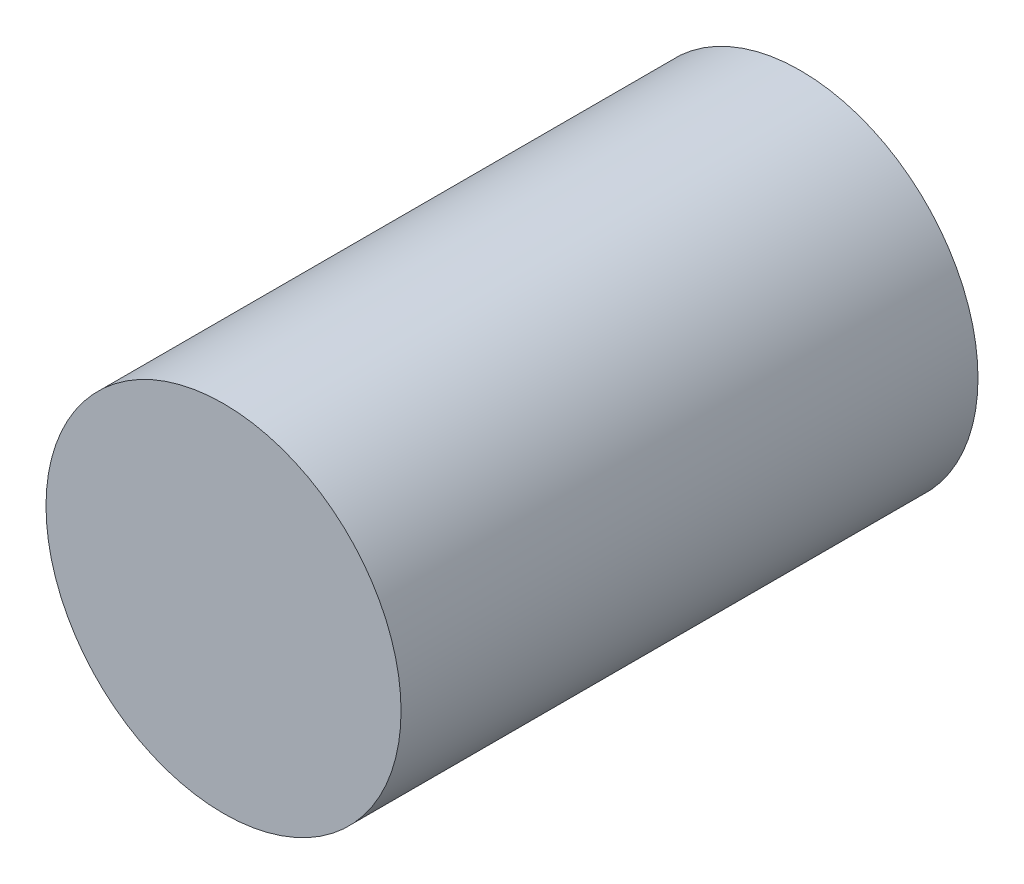
ISO-10303-21;
HEADER;
FILE_DESCRIPTION(('STEP AP214'),'2;1');
FILE_NAME('part.step','',(''),(''),'','','');
FILE_SCHEMA(('AUTOMOTIVE_DESIGN { 1 0 10303 214 1 1 1 1 }'));
ENDSEC;
DATA;
#1=APPLICATION_CONTEXT('core data for automotive mechanical design processes');
#2=APPLICATION_PROTOCOL_DEFINITION('international standard','automotive_design',2000,#1);
#3=PRODUCT_CONTEXT('',#1,'mechanical');
#4=PRODUCT('Part','Part','',(#3));
#5=PRODUCT_RELATED_PRODUCT_CATEGORY('part','',(#4));
#6=PRODUCT_DEFINITION_FORMATION('','',#4);
#7=PRODUCT_DEFINITION_CONTEXT('part definition',#1,'design');
#8=PRODUCT_DEFINITION('design','',#6,#7);
#9=PRODUCT_DEFINITION_SHAPE('','',#8);
#10=(LENGTH_UNIT() NAMED_UNIT(*) SI_UNIT(.MILLI.,.METRE.));
#11=(NAMED_UNIT(*) PLANE_ANGLE_UNIT() SI_UNIT($,.RADIAN.));
#12=(NAMED_UNIT(*) SI_UNIT($,.STERADIAN.) SOLID_ANGLE_UNIT());
#13=UNCERTAINTY_MEASURE_WITH_UNIT(LENGTH_MEASURE(1.E-05),#10,'distance_accuracy_value','');
#14=(GEOMETRIC_REPRESENTATION_CONTEXT(3) GLOBAL_UNCERTAINTY_ASSIGNED_CONTEXT((#13)) GLOBAL_UNIT_ASSIGNED_CONTEXT((#10,
#11,#12)) REPRESENTATION_CONTEXT('',''));
#15=CARTESIAN_POINT('',(0.,0.,0.));
#16=DIRECTION('',(0.,0.,1.));
#17=DIRECTION('',(1.,0.,0.));
#18=AXIS2_PLACEMENT_3D('',#15,#16,#17);
#19=CARTESIAN_POINT('',(4.,4.,13.));
#20=DIRECTION('',(0.,0.,-1.));
#21=DIRECTION('',(-1.,0.,0.));
#22=AXIS2_PLACEMENT_3D('',#19,#20,#21);
#23=CYLINDRICAL_SURFACE('',#22,4.);
#24=CARTESIAN_POINT('',(4.,4.,13.));
#25=DIRECTION('',(0.,0.,1.));
#26=DIRECTION('',(1.,0.,0.));
#27=AXIS2_PLACEMENT_3D('',#24,#25,#26);
#28=CIRCLE('',#27,4.);
#29=CARTESIAN_POINT('',(0.,4.,13.));
#30=VERTEX_POINT('',#29);
#31=EDGE_CURVE('E10',#30,#30,#28,.T.);
#32=CARTESIAN_POINT('',(4.,4.,0.));
#33=DIRECTION('',(0.,0.,1.));
#34=DIRECTION('',(1.,0.,0.));
#35=AXIS2_PLACEMENT_3D('',#32,#33,#34);
#36=CIRCLE('',#35,4.);
#37=CARTESIAN_POINT('',(0.,4.,0.));
#38=VERTEX_POINT('',#37);
#39=EDGE_CURVE('E42',#38,#38,#36,.T.);
#40=CARTESIAN_POINT('',(0.,4.,13.));
#41=CARTESIAN_POINT('',(0.,4.,12.8645833333333));
#42=CARTESIAN_POINT('',(0.,4.,12.7291666666667));
#43=CARTESIAN_POINT('',(0.,4.,12.4583333333333));
#44=CARTESIAN_POINT('',(0.,4.,12.3229166666667));
#45=CARTESIAN_POINT('',(0.,4.,12.0520833333333));
#46=CARTESIAN_POINT('',(0.,4.,11.9166666666667));
#47=CARTESIAN_POINT('',(0.,4.,11.6458333333333));
#48=CARTESIAN_POINT('',(0.,4.,11.5104166666667));
#49=CARTESIAN_POINT('',(0.,4.,11.2395833333333));
#50=CARTESIAN_POINT('',(0.,4.,11.1041666666667));
#51=CARTESIAN_POINT('',(0.,4.,10.8333333333333));
#52=CARTESIAN_POINT('',(0.,4.,10.6979166666667));
#53=CARTESIAN_POINT('',(0.,4.,10.4270833333333));
#54=CARTESIAN_POINT('',(0.,4.,10.2916666666667));
#55=CARTESIAN_POINT('',(0.,4.,10.0208333333333));
#56=CARTESIAN_POINT('',(0.,4.,9.88541666666667));
#57=CARTESIAN_POINT('',(0.,4.,9.61458333333333));
#58=CARTESIAN_POINT('',(0.,4.,9.47916666666667));
#59=CARTESIAN_POINT('',(0.,4.,9.20833333333333));
#60=CARTESIAN_POINT('',(0.,4.,9.07291666666667));
#61=CARTESIAN_POINT('',(0.,4.,8.80208333333333));
#62=CARTESIAN_POINT('',(0.,4.,8.66666666666667));
#63=CARTESIAN_POINT('',(0.,4.,8.39583333333333));
#64=CARTESIAN_POINT('',(0.,4.,8.26041666666667));
#65=CARTESIAN_POINT('',(0.,4.,7.98958333333333));
#66=CARTESIAN_POINT('',(0.,4.,7.85416666666667));
#67=CARTESIAN_POINT('',(0.,4.,7.58333333333333));
#68=CARTESIAN_POINT('',(0.,4.,7.44791666666667));
#69=CARTESIAN_POINT('',(0.,4.,7.17708333333333));
#70=CARTESIAN_POINT('',(0.,4.,7.04166666666667));
#71=CARTESIAN_POINT('',(0.,4.,6.77083333333333));
#72=CARTESIAN_POINT('',(0.,4.,6.63541666666667));
#73=CARTESIAN_POINT('',(0.,4.,6.36458333333333));
#74=CARTESIAN_POINT('',(0.,4.,6.22916666666667));
#75=CARTESIAN_POINT('',(0.,4.,5.95833333333333));
#76=CARTESIAN_POINT('',(0.,4.,5.82291666666667));
#77=CARTESIAN_POINT('',(0.,4.,5.55208333333333));
#78=CARTESIAN_POINT('',(0.,4.,5.41666666666667));
#79=CARTESIAN_POINT('',(0.,4.,5.14583333333333));
#80=CARTESIAN_POINT('',(0.,4.,5.01041666666667));
#81=CARTESIAN_POINT('',(0.,4.,4.73958333333333));
#82=CARTESIAN_POINT('',(0.,4.,4.60416666666667));
#83=CARTESIAN_POINT('',(0.,4.,4.33333333333333));
#84=CARTESIAN_POINT('',(0.,4.,4.19791666666667));
#85=CARTESIAN_POINT('',(0.,4.,3.92708333333333));
#86=CARTESIAN_POINT('',(0.,4.,3.79166666666667));
#87=CARTESIAN_POINT('',(0.,4.,3.52083333333333));
#88=CARTESIAN_POINT('',(0.,4.,3.38541666666667));
#89=CARTESIAN_POINT('',(0.,4.,3.11458333333333));
#90=CARTESIAN_POINT('',(0.,4.,2.97916666666667));
#91=CARTESIAN_POINT('',(0.,4.,2.70833333333333));
#92=CARTESIAN_POINT('',(0.,4.,2.57291666666667));
#93=CARTESIAN_POINT('',(0.,4.,2.30208333333333));
#94=CARTESIAN_POINT('',(0.,4.,2.16666666666667));
#95=CARTESIAN_POINT('',(0.,4.,1.89583333333333));
#96=CARTESIAN_POINT('',(0.,4.,1.76041666666667));
#97=CARTESIAN_POINT('',(0.,4.,1.48958333333333));
#98=CARTESIAN_POINT('',(0.,4.,1.35416666666667));
#99=CARTESIAN_POINT('',(0.,4.,1.08333333333333));
#100=CARTESIAN_POINT('',(0.,4.,0.947916666666667));
#101=CARTESIAN_POINT('',(0.,4.,0.677083333333334));
#102=CARTESIAN_POINT('',(0.,4.,0.541666666666667));
#103=CARTESIAN_POINT('',(0.,4.,0.270833333333334));
#104=CARTESIAN_POINT('',(0.,4.,0.135416666666667));
#105=CARTESIAN_POINT('',(0.,4.,0.));
#106=B_SPLINE_CURVE_WITH_KNOTS('',3,(#40,#41,#42,#43,#44,#45,#46,#47,#48,#49,#50,#51,#52,#53,
#54,#55,#56,#57,#58,#59,#60,#61,#62,#63,#64,#65,#66,#67,#68,#69,#70,#71,#72,#73,#74,#75,#76,#77,
#78,#79,#80,#81,#82,#83,#84,#85,#86,#87,#88,#89,#90,#91,#92,#93,#94,#95,#96,#97,#98,#99,#100,
#101,#102,#103,#104,#105),.UNSPECIFIED.,.F.,.F.,(4,2,2,2,2,2,2,2,2,2,2,2,2,2,2,2,2,2,2,2,2,2,2,
2,2,2,2,2,2,2,2,2,4),(0.,0.406249999999999,0.812499999999999,1.21875,1.625,2.03125,2.4375,
2.84375,3.25,3.65625,4.0625,4.46875,4.875,5.28125,5.6875,6.09375,6.5,6.90625,7.3125,7.71875,
8.125,8.53125,8.9375,9.34375,9.75,10.15625,10.5625,10.96875,11.375,11.78125,12.1875,12.59375,
13.),.UNSPECIFIED.);
#107=EDGE_CURVE('BSEAM41',#30,#38,#106,.T.);
#108=ORIENTED_EDGE('',*,*,#31,.F.);
#109=ORIENTED_EDGE('',*,*,#39,.T.);
#110=ORIENTED_EDGE('',*,*,#107,.T.);
#111=ORIENTED_EDGE('',*,*,#107,.F.);
#112=EDGE_LOOP('',(#108,#110,#109,#111));
#113=FACE_BOUND('',#112,.T.);
#114=ADVANCED_FACE('F41',(#113),#23,.T.);
#115=CARTESIAN_POINT('',(4.,4.,13.));
#116=DIRECTION('',(0.,0.,1.));
#117=DIRECTION('',(1.,0.,0.));
#118=AXIS2_PLACEMENT_3D('',#115,#116,#117);
#119=PLANE('',#118);
#120=ORIENTED_EDGE('',*,*,#31,.T.);
#121=EDGE_LOOP('',(#120));
#122=FACE_BOUND('',#121,.T.);
#123=ADVANCED_FACE('F57',(#122),#119,.T.);
#124=CARTESIAN_POINT('',(4.,4.,0.));
#125=DIRECTION('',(0.,0.,1.));
#126=DIRECTION('',(1.,0.,0.));
#127=AXIS2_PLACEMENT_3D('',#124,#125,#126);
#128=PLANE('',#127);
#129=ORIENTED_EDGE('',*,*,#39,.F.);
#130=EDGE_LOOP('',(#129));
#131=FACE_BOUND('',#130,.T.);
#132=ADVANCED_FACE('F53',(#131),#128,.F.);
#133=CLOSED_SHELL('',(#114,#123,#132));
#134=MANIFOLD_SOLID_BREP('B2',#133);
#135=ADVANCED_BREP_SHAPE_REPRESENTATION('',(#18,#134),#14);
#136=SHAPE_DEFINITION_REPRESENTATION(#9,#135);
ENDSEC;
END-ISO-10303-21;
